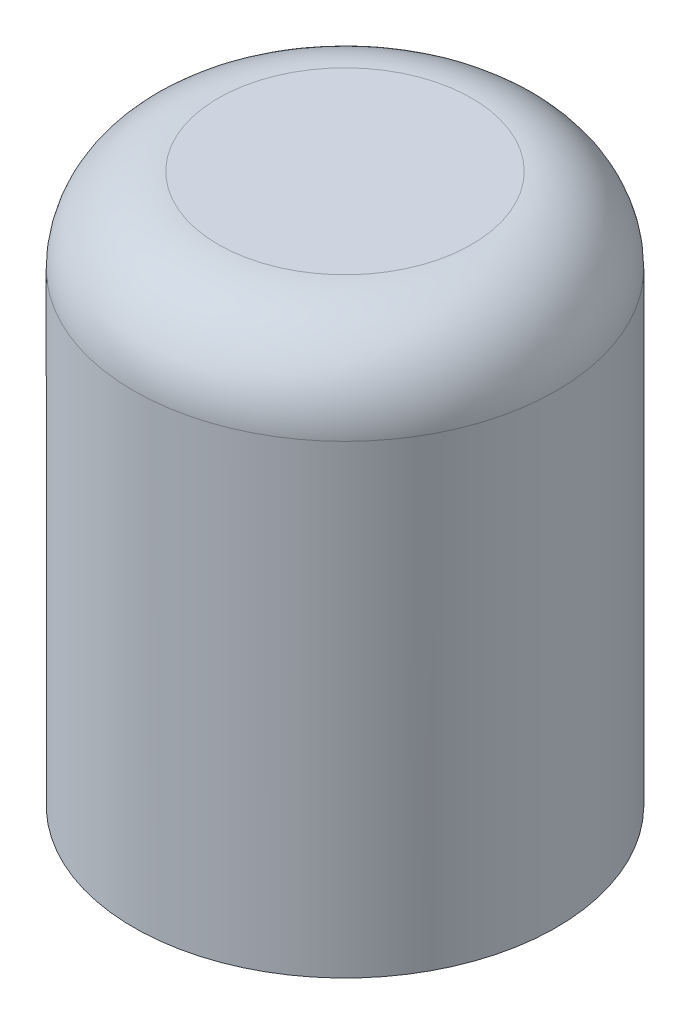
ISO-10303-21;
HEADER;
FILE_DESCRIPTION(('STEP AP214'),'2;1');
FILE_NAME('part.step','',(''),(''),'','','');
FILE_SCHEMA(('AUTOMOTIVE_DESIGN { 1 0 10303 214 1 1 1 1 }'));
ENDSEC;
DATA;
#1=APPLICATION_CONTEXT('core data for automotive mechanical design processes');
#2=APPLICATION_PROTOCOL_DEFINITION('international standard','automotive_design',2000,#1);
#3=PRODUCT_CONTEXT('',#1,'mechanical');
#4=PRODUCT('Part','Part','',(#3));
#5=PRODUCT_RELATED_PRODUCT_CATEGORY('part','',(#4));
#6=PRODUCT_DEFINITION_FORMATION('','',#4);
#7=PRODUCT_DEFINITION_CONTEXT('part definition',#1,'design');
#8=PRODUCT_DEFINITION('design','',#6,#7);
#9=PRODUCT_DEFINITION_SHAPE('','',#8);
#10=(LENGTH_UNIT() NAMED_UNIT(*) SI_UNIT(.MILLI.,.METRE.));
#11=(NAMED_UNIT(*) PLANE_ANGLE_UNIT() SI_UNIT($,.RADIAN.));
#12=(NAMED_UNIT(*) SI_UNIT($,.STERADIAN.) SOLID_ANGLE_UNIT());
#13=UNCERTAINTY_MEASURE_WITH_UNIT(LENGTH_MEASURE(1.E-05),#10,'distance_accuracy_value','');
#14=(GEOMETRIC_REPRESENTATION_CONTEXT(3) GLOBAL_UNCERTAINTY_ASSIGNED_CONTEXT((#13)) GLOBAL_UNIT_ASSIGNED_CONTEXT((#10,
#11,#12)) REPRESENTATION_CONTEXT('',''));
#15=CARTESIAN_POINT('',(0.,0.,0.));
#16=DIRECTION('',(0.,0.,1.));
#17=DIRECTION('',(1.,0.,0.));
#18=AXIS2_PLACEMENT_3D('',#15,#16,#17);
#19=CARTESIAN_POINT('',(0.,11.,0.));
#20=DIRECTION('',(0.,1.,0.));
#21=DIRECTION('',(0.,0.,1.));
#22=AXIS2_PLACEMENT_3D('',#19,#20,#21);
#23=TOROIDAL_SURFACE('',#22,3.,2.);
#24=CARTESIAN_POINT('',(0.,13.,0.));
#25=DIRECTION('',(0.,1.,0.));
#26=DIRECTION('',(0.,0.,1.));
#27=AXIS2_PLACEMENT_3D('',#24,#25,#26);
#28=CIRCLE('',#27,3.);
#29=CARTESIAN_POINT('',(0.,13.,3.));
#30=VERTEX_POINT('',#29);
#31=EDGE_CURVE('E40',#30,#30,#28,.T.);
#32=ORIENTED_EDGE('',*,*,#31,.F.);
#33=EDGE_LOOP('',(#32));
#34=FACE_BOUND('',#33,.T.);
#35=CARTESIAN_POINT('',(0.,11.,0.));
#36=DIRECTION('',(0.,1.,0.));
#37=DIRECTION('',(0.,0.,1.));
#38=AXIS2_PLACEMENT_3D('',#35,#36,#37);
#39=CIRCLE('',#38,5.);
#40=CARTESIAN_POINT('',(0.,11.,-5.));
#41=VERTEX_POINT('',#40);
#42=EDGE_CURVE('E11',#41,#41,#39,.F.);
#43=ORIENTED_EDGE('',*,*,#42,.F.);
#44=EDGE_LOOP('',(#43));
#45=FACE_BOUND('',#44,.T.);
#46=ADVANCED_FACE('F33',(#34,#45),#23,.T.);
#47=CARTESIAN_POINT('',(0.,0.5,0.));
#48=DIRECTION('',(0.,1.,0.));
#49=DIRECTION('',(0.,0.,1.));
#50=AXIS2_PLACEMENT_3D('',#47,#48,#49);
#51=TOROIDAL_SURFACE('',#50,3.9,0.5);
#52=CARTESIAN_POINT('',(-1.6,0.5,-3.));
#53=CARTESIAN_POINT('',(-1.59996653336158,0.474655655045489,-2.99997748759709));
#54=CARTESIAN_POINT('',(-1.60192456088418,0.449343334582389,-3.00115475988792));
#55=CARTESIAN_POINT('',(-1.60954931175446,0.39960635434801,-3.0057256157953));
#56=CARTESIAN_POINT('',(-1.61519862589409,0.375178093044717,-3.00910879553703));
#57=CARTESIAN_POINT('',(-1.62992846621741,0.327807220219106,-3.01790664048083));
#58=CARTESIAN_POINT('',(-1.63900537969103,0.304863074151547,-3.02331916669712));
#59=CARTESIAN_POINT('',(-1.66018400945888,0.260924715208379,-3.03590220306984));
#60=CARTESIAN_POINT('',(-1.672288612033,0.239932389337187,-3.04307439057656));
#61=CARTESIAN_POINT('',(-1.69984315670586,0.199143280719104,-3.05933078320421));
#62=CARTESIAN_POINT('',(-1.71544511489751,0.179484057228913,-3.06850103812007));
#63=CARTESIAN_POINT('',(-1.74900696316234,0.143043246008861,-3.08812587621663));
#64=CARTESIAN_POINT('',(-1.76696746391606,0.126262406162343,-3.09858079198013));
#65=CARTESIAN_POINT('',(-1.80732775012166,0.0936707605734556,-3.1219439158314));
#66=CARTESIAN_POINT('',(-1.82999944302008,0.0782976180755462,-3.134992718335));
#67=CARTESIAN_POINT('',(-1.87715528907021,0.0515854108273254,-3.16195210210392));
#68=CARTESIAN_POINT('',(-1.90164126290976,0.0402504666248506,-3.17586354671094));
#69=CARTESIAN_POINT('',(-1.95393263916719,0.0209334381087745,-3.20536936435397));
#70=CARTESIAN_POINT('',(-1.98184477585947,0.0133083882556781,-3.22100750525132));
#71=CARTESIAN_POINT('',(-2.03840760979031,0.00297884686105236,-3.25246275252574));
#72=CARTESIAN_POINT('',(-2.0670565310083,0.000263475752786359,-3.26827938485846));
#73=CARTESIAN_POINT('',(-2.0971516151827,6.07421043160522E-06,-3.28477494525696));
#74=CARTESIAN_POINT('',(-2.09857580350981,-1.17873286186587E-08,-3.28555528331048));
#75=CARTESIAN_POINT('',(-2.1,0.,-3.286335345031));
#76=B_SPLINE_CURVE_WITH_KNOTS('',3,(#52,#53,#54,#55,#56,#57,#58,#59,#60,#61,#62,#63,#64,#65,#66,
#67,#68,#69,#70,#71,#72,#73,#74,#75),.UNSPECIFIED.,.F.,.F.,(4,2,2,2,2,2,2,2,2,2,2,4),(0.,
0.0758798719797855,0.151404430177597,0.22684960623021,0.302366979720791,0.382214239752754,
0.462082214978432,0.552745106091461,0.643500245755483,0.741799513398234,0.839880687285974,
0.844752542984097),.UNSPECIFIED.);
#77=CARTESIAN_POINT('',(-2.1,0.,-3.286335345031));
#78=VERTEX_POINT('',#77);
#79=CARTESIAN_POINT('',(-1.6,0.5,-3.));
#80=VERTEX_POINT('',#79);
#81=EDGE_CURVE('E55',#78,#80,#76,.F.);
#82=ORIENTED_EDGE('',*,*,#81,.F.);
#83=CARTESIAN_POINT('',(0.,0.,0.));
#84=DIRECTION('',(0.,1.,0.));
#85=DIRECTION('',(0.,0.,1.));
#86=AXIS2_PLACEMENT_3D('',#83,#84,#85);
#87=CIRCLE('',#86,3.9);
#88=CARTESIAN_POINT('',(-2.1,0.,3.286335345031));
#89=VERTEX_POINT('',#88);
#90=EDGE_CURVE('E85',#89,#78,#87,.T.);
#91=ORIENTED_EDGE('',*,*,#90,.F.);
#92=CARTESIAN_POINT('',(-1.6,0.5,3.));
#93=CARTESIAN_POINT('',(-1.59996653336158,0.474655655045489,2.99997748759709));
#94=CARTESIAN_POINT('',(-1.60192456088418,0.449343334582389,3.00115475988792));
#95=CARTESIAN_POINT('',(-1.60954931175446,0.39960635434801,3.0057256157953));
#96=CARTESIAN_POINT('',(-1.61519862589409,0.375178093044717,3.00910879553703));
#97=CARTESIAN_POINT('',(-1.62992846621741,0.327807220219106,3.01790664048083));
#98=CARTESIAN_POINT('',(-1.63900537969103,0.304863074151547,3.02331916669712));
#99=CARTESIAN_POINT('',(-1.66018400945888,0.260924715208379,3.03590220306984));
#100=CARTESIAN_POINT('',(-1.672288612033,0.239932389337187,3.04307439057656));
#101=CARTESIAN_POINT('',(-1.69984315670586,0.199143280719104,3.05933078320421));
#102=CARTESIAN_POINT('',(-1.71544511489751,0.179484057228913,3.06850103812007));
#103=CARTESIAN_POINT('',(-1.74900696316234,0.143043246008861,3.08812587621663));
#104=CARTESIAN_POINT('',(-1.76696746391606,0.126262406162343,3.09858079198013));
#105=CARTESIAN_POINT('',(-1.80732775012166,0.0936707605734556,3.1219439158314));
#106=CARTESIAN_POINT('',(-1.82999944302008,0.0782976180755462,3.134992718335));
#107=CARTESIAN_POINT('',(-1.87715528907021,0.0515854108273254,3.16195210210392));
#108=CARTESIAN_POINT('',(-1.90164126290976,0.0402504666248506,3.17586354671094));
#109=CARTESIAN_POINT('',(-1.95393263916719,0.0209334381087745,3.20536936435397));
#110=CARTESIAN_POINT('',(-1.98184477585947,0.0133083882556781,3.22100750525132));
#111=CARTESIAN_POINT('',(-2.03840760979031,0.00297884686105236,3.25246275252574));
#112=CARTESIAN_POINT('',(-2.0670565310083,0.000263475752786359,3.26827938485846));
#113=CARTESIAN_POINT('',(-2.0971516151827,6.07421043160522E-06,3.28477494525696));
#114=CARTESIAN_POINT('',(-2.09857580350981,-1.17873286186587E-08,3.28555528331048));
#115=CARTESIAN_POINT('',(-2.1,0.,3.286335345031));
#116=B_SPLINE_CURVE_WITH_KNOTS('',3,(#92,#93,#94,#95,#96,#97,#98,#99,#100,#101,#102,#103,#104,
#105,#106,#107,#108,#109,#110,#111,#112,#113,#114,#115),.UNSPECIFIED.,.F.,.F.,(4,2,2,2,2,2,2,2,
2,2,2,4),(0.,0.0758798719797855,0.151404430177597,0.22684960623021,0.302366979720791,
0.382214239752754,0.462082214978432,0.552745106091461,0.643500245755483,0.741799513398234,
0.839880687285974,0.844752542984097),.UNSPECIFIED.);
#117=CARTESIAN_POINT('',(-1.6,0.5,3.));
#118=VERTEX_POINT('',#117);
#119=EDGE_CURVE('E47',#89,#118,#116,.F.);
#120=ORIENTED_EDGE('',*,*,#119,.T.);
#121=CARTESIAN_POINT('',(0.,0.5,0.));
#122=DIRECTION('',(0.,1.,0.));
#123=DIRECTION('',(0.,0.,1.));
#124=AXIS2_PLACEMENT_3D('',#121,#122,#123);
#125=CIRCLE('',#124,3.4);
#126=EDGE_CURVE('E105',#80,#118,#125,.F.);
#127=ORIENTED_EDGE('',*,*,#126,.F.);
#128=EDGE_LOOP('',(#82,#91,#120,#127));
#129=FACE_BOUND('',#128,.T.);
#130=ADVANCED_FACE('F128',(#129),#51,.T.);
#131=CARTESIAN_POINT('',(-2.1,0.5,0.));
#132=DIRECTION('',(0.,0.,1.));
#133=DIRECTION('',(1.,0.,0.));
#134=AXIS2_PLACEMENT_3D('',#131,#132,#133);
#135=CYLINDRICAL_SURFACE('',#134,0.5);
#136=DIRECTION('',(0.,0.,1.));
#137=VECTOR('',#136,1.);
#138=CARTESIAN_POINT('',(-2.1,0.,0.));
#139=LINE('',#138,#137);
#140=EDGE_CURVE('E241',#78,#89,#139,.T.);
#141=ORIENTED_EDGE('',*,*,#140,.F.);
#142=ORIENTED_EDGE('',*,*,#81,.T.);
#143=DIRECTION('',(0.,0.,1.));
#144=VECTOR('',#143,1.);
#145=CARTESIAN_POINT('',(-1.6,0.5,3.));
#146=LINE('',#145,#144);
#147=EDGE_CURVE('E242',#118,#80,#146,.F.);
#148=ORIENTED_EDGE('',*,*,#147,.F.);
#149=ORIENTED_EDGE('',*,*,#119,.F.);
#150=EDGE_LOOP('',(#141,#142,#148,#149));
#151=FACE_BOUND('',#150,.T.);
#152=ADVANCED_FACE('F127',(#151),#135,.T.);
#153=CARTESIAN_POINT('',(0.4,10.5,3.));
#154=DIRECTION('',(0.,0.,1.));
#155=DIRECTION('',(1.,0.,0.));
#156=AXIS2_PLACEMENT_3D('',#153,#154,#155);
#157=CYLINDRICAL_SURFACE('',#156,2.);
#158=CARTESIAN_POINT('',(-1.6,10.5,3.));
#159=CARTESIAN_POINT('',(-1.60000850052448,10.5499518875477,3.00000246288949));
#160=CARTESIAN_POINT('',(-1.59812880702974,10.5998996094297,2.99887721606991));
#161=CARTESIAN_POINT('',(-1.5906577194978,10.6994029975552,2.9943909238045));
#162=CARTESIAN_POINT('',(-1.5850672892926,10.7489587622248,2.9910304589369));
#163=CARTESIAN_POINT('',(-1.57026579448421,10.847145439876,2.98210926909196));
#164=CARTESIAN_POINT('',(-1.5610677133565,10.8957790208977,2.97655643370621));
#165=CARTESIAN_POINT('',(-1.53918254627121,10.9919416066029,2.96329220666491));
#166=CARTESIAN_POINT('',(-1.52649536552977,11.0394705812409,2.95558075636895));
#167=CARTESIAN_POINT('',(-1.48344028707066,11.1798536812875,2.92928276191602));
#168=CARTESIAN_POINT('',(-1.44805692833628,11.2706459903938,2.90751961592628));
#169=CARTESIAN_POINT('',(-1.36565775318506,11.4443077197239,2.85605095302861));
#170=CARTESIAN_POINT('',(-1.31863555075307,11.5271727556783,2.82634107517395));
#171=CARTESIAN_POINT('',(-1.21298744874626,11.6864896785948,2.75825266379178));
#172=CARTESIAN_POINT('',(-1.15397639945733,11.762558676547,2.71957793691912));
#173=CARTESIAN_POINT('',(-1.02815406520325,11.9033178959098,2.6349845426604));
#174=CARTESIAN_POINT('',(-0.961340390469918,11.9680046158989,2.58906365441816));
#175=CARTESIAN_POINT('',(-0.814288092836759,12.0924283419519,2.48484586936023));
#176=CARTESIAN_POINT('',(-0.733393441087431,12.1507000293333,2.42572953336291));
#177=CARTESIAN_POINT('',(-0.568326358374677,12.2526474266485,2.29998549858874));
#178=CARTESIAN_POINT('',(-0.484151709712952,12.2963130629015,2.23335265791833));
#179=CARTESIAN_POINT('',(-0.302097433662295,12.3757473093935,2.08186691219491));
#180=CARTESIAN_POINT('',(-0.204184044483526,12.4091276820456,1.99580557853499));
#181=CARTESIAN_POINT('',(-0.0126260183175983,12.459476367687,1.81484167051084));
#182=CARTESIAN_POINT('',(0.0810206871817594,12.4764527158765,1.71994344972939));
#183=CARTESIAN_POINT('',(0.248895876606051,12.4958446022482,1.53347825387043));
#184=CARTESIAN_POINT('',(0.324094306478029,12.4997991416193,1.44294663881494));
#185=CARTESIAN_POINT('',(0.396356673937455,12.499997534813,1.34652214633477));
#186=CARTESIAN_POINT('',(0.398179951667647,12.5000000202477,1.34408262845093));
#187=CARTESIAN_POINT('',(0.4,12.5,1.34164078649987));
#188=B_SPLINE_CURVE_WITH_KNOTS('',3,(#158,#159,#160,#161,#162,#163,#164,#165,#166,#167,#168,
#169,#170,#171,#172,#173,#174,#175,#176,#177,#178,#179,#180,#181,#182,#183,#184,#185,#186,#187),
.UNSPECIFIED.,.F.,.F.,(4,2,2,2,2,2,2,2,2,2,2,2,2,2,4),(0.,0.149800595576883,0.299562296952954,
0.448789898870816,0.598021555063173,0.89605758056682,1.1942574967554,1.5042427389955,
1.81432317295878,2.16069390970938,2.50730304548163,2.90947850423739,3.31145686495936,
3.66380374430213,3.67294048712481),.UNSPECIFIED.);
#189=CARTESIAN_POINT('',(-1.6,10.5,3.));
#190=VERTEX_POINT('',#189);
#191=CARTESIAN_POINT('',(0.4,12.5,1.34164078649987));
#192=VERTEX_POINT('',#191);
#193=EDGE_CURVE('E74',#190,#192,#188,.T.);
#194=ORIENTED_EDGE('',*,*,#193,.F.);
#195=DIRECTION('',(0.,0.,1.));
#196=VECTOR('',#195,1.);
#197=CARTESIAN_POINT('',(-1.6,10.5,3.));
#198=LINE('',#197,#196);
#199=CARTESIAN_POINT('',(-1.6,10.5,-3.));
#200=VERTEX_POINT('',#199);
#201=EDGE_CURVE('E77',#200,#190,#198,.T.);
#202=ORIENTED_EDGE('',*,*,#201,.F.);
#203=CARTESIAN_POINT('',(-1.6,10.5,-3.));
#204=CARTESIAN_POINT('',(-1.60000850052448,10.5499518875477,-3.00000246288949));
#205=CARTESIAN_POINT('',(-1.59812880702974,10.5998996094297,-2.99887721606991));
#206=CARTESIAN_POINT('',(-1.5906577194978,10.6994029975552,-2.9943909238045));
#207=CARTESIAN_POINT('',(-1.5850672892926,10.7489587622248,-2.9910304589369));
#208=CARTESIAN_POINT('',(-1.57026579448421,10.847145439876,-2.98210926909196));
#209=CARTESIAN_POINT('',(-1.5610677133565,10.8957790208977,-2.97655643370621));
#210=CARTESIAN_POINT('',(-1.53918254627121,10.9919416066029,-2.96329220666491));
#211=CARTESIAN_POINT('',(-1.52649536552977,11.0394705812409,-2.95558075636895));
#212=CARTESIAN_POINT('',(-1.48344028707066,11.1798536812875,-2.92928276191602));
#213=CARTESIAN_POINT('',(-1.44805692833628,11.2706459903938,-2.90751961592628));
#214=CARTESIAN_POINT('',(-1.36565775318506,11.4443077197239,-2.85605095302861));
#215=CARTESIAN_POINT('',(-1.31863555075307,11.5271727556783,-2.82634107517395));
#216=CARTESIAN_POINT('',(-1.21298744874626,11.6864896785948,-2.75825266379178));
#217=CARTESIAN_POINT('',(-1.15397639945733,11.762558676547,-2.71957793691912));
#218=CARTESIAN_POINT('',(-1.02815406520325,11.9033178959098,-2.6349845426604));
#219=CARTESIAN_POINT('',(-0.961340390469918,11.9680046158989,-2.58906365441816));
#220=CARTESIAN_POINT('',(-0.814288092836759,12.0924283419519,-2.48484586936023));
#221=CARTESIAN_POINT('',(-0.733393441087431,12.1507000293333,-2.42572953336291));
#222=CARTESIAN_POINT('',(-0.568326358374677,12.2526474266485,-2.29998549858874));
#223=CARTESIAN_POINT('',(-0.484151709712952,12.2963130629015,-2.23335265791833));
#224=CARTESIAN_POINT('',(-0.302097433662295,12.3757473093935,-2.08186691219491));
#225=CARTESIAN_POINT('',(-0.204184044483526,12.4091276820456,-1.99580557853499));
#226=CARTESIAN_POINT('',(-0.0126260183175983,12.459476367687,-1.81484167051084));
#227=CARTESIAN_POINT('',(0.0810206871817594,12.4764527158765,-1.71994344972939));
#228=CARTESIAN_POINT('',(0.248895876606051,12.4958446022482,-1.53347825387043));
#229=CARTESIAN_POINT('',(0.324094306478029,12.4997991416193,-1.44294663881494));
#230=CARTESIAN_POINT('',(0.396356673937455,12.499997534813,-1.34652214633477));
#231=CARTESIAN_POINT('',(0.398179951667647,12.5000000202477,-1.34408262845093));
#232=CARTESIAN_POINT('',(0.4,12.5,-1.34164078649987));
#233=B_SPLINE_CURVE_WITH_KNOTS('',3,(#203,#204,#205,#206,#207,#208,#209,#210,#211,#212,#213,
#214,#215,#216,#217,#218,#219,#220,#221,#222,#223,#224,#225,#226,#227,#228,#229,#230,#231,#232),
.UNSPECIFIED.,.F.,.F.,(4,2,2,2,2,2,2,2,2,2,2,2,2,2,4),(0.,0.149800595576883,0.299562296952954,
0.448789898870816,0.598021555063173,0.89605758056682,1.1942574967554,1.5042427389955,
1.81432317295878,2.16069390970938,2.50730304548163,2.90947850423739,3.31145686495936,
3.66380374430213,3.67294048712481),.UNSPECIFIED.);
#234=CARTESIAN_POINT('',(0.4,12.5,-1.34164078649987));
#235=VERTEX_POINT('',#234);
#236=EDGE_CURVE('E86',#200,#235,#233,.T.);
#237=ORIENTED_EDGE('',*,*,#236,.T.);
#238=DIRECTION('',(0.,0.,1.));
#239=VECTOR('',#238,1.);
#240=CARTESIAN_POINT('',(0.4,12.5,0.));
#241=LINE('',#240,#239);
#242=EDGE_CURVE('E80',#192,#235,#241,.F.);
#243=ORIENTED_EDGE('',*,*,#242,.F.);
#244=EDGE_LOOP('',(#194,#202,#237,#243));
#245=FACE_BOUND('',#244,.T.);
#246=ADVANCED_FACE('F76',(#245),#157,.F.);
#247=CARTESIAN_POINT('',(0.,10.5,0.));
#248=DIRECTION('',(0.,-1.,0.));
#249=DIRECTION('',(0.,0.,-1.));
#250=AXIS2_PLACEMENT_3D('',#247,#248,#249);
#251=DEGENERATE_TOROIDAL_SURFACE('',#250,1.4,2.,.T.);
#252=CARTESIAN_POINT('',(0.,10.5,0.));
#253=DIRECTION('',(0.,-1.,0.));
#254=DIRECTION('',(0.,0.,-1.));
#255=AXIS2_PLACEMENT_3D('',#252,#253,#254);
#256=CIRCLE('',#255,3.4);
#257=EDGE_CURVE('E99',#190,#200,#256,.F.);
#258=ORIENTED_EDGE('',*,*,#257,.F.);
#259=ORIENTED_EDGE('',*,*,#193,.T.);
#260=CARTESIAN_POINT('',(0.,12.5,0.));
#261=DIRECTION('',(0.,-1.,0.));
#262=DIRECTION('',(0.,0.,-1.));
#263=AXIS2_PLACEMENT_3D('',#260,#261,#262);
#264=CIRCLE('',#263,1.4);
#265=EDGE_CURVE('E97',#235,#192,#264,.T.);
#266=ORIENTED_EDGE('',*,*,#265,.F.);
#267=ORIENTED_EDGE('',*,*,#236,.F.);
#268=EDGE_LOOP('',(#258,#259,#266,#267));
#269=FACE_BOUND('',#268,.T.);
#270=ADVANCED_FACE('F100',(#269),#251,.F.);
#271=CARTESIAN_POINT('',(0.,13.,0.));
#272=DIRECTION('',(0.,-1.,0.));
#273=DIRECTION('',(0.,0.,-1.));
#274=AXIS2_PLACEMENT_3D('',#271,#272,#273);
#275=CYLINDRICAL_SURFACE('',#274,5.);
#276=CARTESIAN_POINT('',(0.,0.,0.));
#277=DIRECTION('',(0.,1.,0.));
#278=DIRECTION('',(0.,0.,1.));
#279=AXIS2_PLACEMENT_3D('',#276,#277,#278);
#280=CIRCLE('',#279,5.);
#281=CARTESIAN_POINT('',(0.,0.,-5.));
#282=VERTEX_POINT('',#281);
#283=EDGE_CURVE('E102',#282,#282,#280,.T.);
#284=CARTESIAN_POINT('',(0.,11.,-5.));
#285=CARTESIAN_POINT('',(0.,10.8854166666667,-5.));
#286=CARTESIAN_POINT('',(0.,10.7708333333333,-5.));
#287=CARTESIAN_POINT('',(0.,10.5416666666667,-5.));
#288=CARTESIAN_POINT('',(0.,10.4270833333333,-5.));
#289=CARTESIAN_POINT('',(0.,10.1979166666667,-5.));
#290=CARTESIAN_POINT('',(0.,10.0833333333333,-5.));
#291=CARTESIAN_POINT('',(0.,9.85416666666667,-5.));
#292=CARTESIAN_POINT('',(0.,9.73958333333333,-5.));
#293=CARTESIAN_POINT('',(0.,9.51041666666667,-5.));
#294=CARTESIAN_POINT('',(0.,9.39583333333333,-5.));
#295=CARTESIAN_POINT('',(0.,9.16666666666666,-5.));
#296=CARTESIAN_POINT('',(0.,9.05208333333333,-5.));
#297=CARTESIAN_POINT('',(0.,8.82291666666666,-5.));
#298=CARTESIAN_POINT('',(0.,8.70833333333333,-5.));
#299=CARTESIAN_POINT('',(0.,8.47916666666666,-5.));
#300=CARTESIAN_POINT('',(0.,8.36458333333333,-5.));
#301=CARTESIAN_POINT('',(0.,8.13541666666667,-5.));
#302=CARTESIAN_POINT('',(0.,8.02083333333333,-5.));
#303=CARTESIAN_POINT('',(0.,7.79166666666667,-5.));
#304=CARTESIAN_POINT('',(0.,7.67708333333333,-5.));
#305=CARTESIAN_POINT('',(0.,7.44791666666667,-5.));
#306=CARTESIAN_POINT('',(0.,7.33333333333333,-5.));
#307=CARTESIAN_POINT('',(0.,7.10416666666667,-5.));
#308=CARTESIAN_POINT('',(0.,6.98958333333333,-5.));
#309=CARTESIAN_POINT('',(0.,6.76041666666667,-5.));
#310=CARTESIAN_POINT('',(0.,6.64583333333333,-5.));
#311=CARTESIAN_POINT('',(0.,6.41666666666667,-5.));
#312=CARTESIAN_POINT('',(0.,6.30208333333333,-5.));
#313=CARTESIAN_POINT('',(0.,6.07291666666667,-5.));
#314=CARTESIAN_POINT('',(0.,5.95833333333333,-5.));
#315=CARTESIAN_POINT('',(0.,5.72916666666667,-5.));
#316=CARTESIAN_POINT('',(0.,5.61458333333333,-5.));
#317=CARTESIAN_POINT('',(0.,5.38541666666667,-5.));
#318=CARTESIAN_POINT('',(0.,5.27083333333333,-5.));
#319=CARTESIAN_POINT('',(0.,5.04166666666667,-5.));
#320=CARTESIAN_POINT('',(0.,4.92708333333333,-5.));
#321=CARTESIAN_POINT('',(0.,4.69791666666667,-5.));
#322=CARTESIAN_POINT('',(0.,4.58333333333333,-5.));
#323=CARTESIAN_POINT('',(0.,4.35416666666667,-5.));
#324=CARTESIAN_POINT('',(0.,4.23958333333333,-5.));
#325=CARTESIAN_POINT('',(0.,4.01041666666667,-5.));
#326=CARTESIAN_POINT('',(0.,3.89583333333333,-5.));
#327=CARTESIAN_POINT('',(0.,3.66666666666667,-5.));
#328=CARTESIAN_POINT('',(0.,3.55208333333333,-5.));
#329=CARTESIAN_POINT('',(0.,3.32291666666667,-5.));
#330=CARTESIAN_POINT('',(0.,3.20833333333333,-5.));
#331=CARTESIAN_POINT('',(0.,2.97916666666667,-5.));
#332=CARTESIAN_POINT('',(0.,2.86458333333333,-5.));
#333=CARTESIAN_POINT('',(0.,2.63541666666667,-5.));
#334=CARTESIAN_POINT('',(0.,2.52083333333333,-5.));
#335=CARTESIAN_POINT('',(0.,2.29166666666667,-5.));
#336=CARTESIAN_POINT('',(0.,2.17708333333333,-5.));
#337=CARTESIAN_POINT('',(0.,1.94791666666667,-5.));
#338=CARTESIAN_POINT('',(0.,1.83333333333333,-5.));
#339=CARTESIAN_POINT('',(0.,1.60416666666667,-5.));
#340=CARTESIAN_POINT('',(0.,1.48958333333333,-5.));
#341=CARTESIAN_POINT('',(0.,1.26041666666667,-5.));
#342=CARTESIAN_POINT('',(0.,1.14583333333333,-5.));
#343=CARTESIAN_POINT('',(0.,0.916666666666666,-5.));
#344=CARTESIAN_POINT('',(0.,0.802083333333333,-5.));
#345=CARTESIAN_POINT('',(0.,0.572916666666667,-5.));
#346=CARTESIAN_POINT('',(0.,0.458333333333334,-5.));
#347=CARTESIAN_POINT('',(0.,0.229166666666667,-5.));
#348=CARTESIAN_POINT('',(0.,0.114583333333334,-5.));
#349=CARTESIAN_POINT('',(0.,0.,-5.));
#350=B_SPLINE_CURVE_WITH_KNOTS('',3,(#284,#285,#286,#287,#288,#289,#290,#291,#292,#293,#294,
#295,#296,#297,#298,#299,#300,#301,#302,#303,#304,#305,#306,#307,#308,#309,#310,#311,#312,#313,
#314,#315,#316,#317,#318,#319,#320,#321,#322,#323,#324,#325,#326,#327,#328,#329,#330,#331,#332,
#333,#334,#335,#336,#337,#338,#339,#340,#341,#342,#343,#344,#345,#346,#347,#348,#349),
.UNSPECIFIED.,.F.,.F.,(4,2,2,2,2,2,2,2,2,2,2,2,2,2,2,2,2,2,2,2,2,2,2,2,2,2,2,2,2,2,2,2,4),(0.,
0.343749999999999,0.687499999999999,1.03125,1.375,1.71875,2.0625,2.40625,2.75,3.09375,3.4375,
3.78125,4.125,4.46875,4.8125,5.15625,5.5,5.84375,6.1875,6.53125,6.875,7.21875,7.5625,7.90625,
8.25,8.59375,8.9375,9.28125,9.625,9.96875,10.3125,10.65625,11.),.UNSPECIFIED.);
#351=EDGE_CURVE('BSEAM152',#41,#282,#350,.T.);
#352=ORIENTED_EDGE('',*,*,#42,.T.);
#353=ORIENTED_EDGE('',*,*,#283,.T.);
#354=ORIENTED_EDGE('',*,*,#351,.T.);
#355=ORIENTED_EDGE('',*,*,#351,.F.);
#356=EDGE_LOOP('',(#352,#354,#353,#355));
#357=FACE_BOUND('',#356,.T.);
#358=ADVANCED_FACE('F152',(#357),#275,.T.);
#359=CARTESIAN_POINT('',(0.,13.,0.));
#360=DIRECTION('',(0.,1.,0.));
#361=DIRECTION('',(0.,0.,1.));
#362=AXIS2_PLACEMENT_3D('',#359,#360,#361);
#363=PLANE('',#362);
#364=ORIENTED_EDGE('',*,*,#31,.T.);
#365=EDGE_LOOP('',(#364));
#366=FACE_BOUND('',#365,.T.);
#367=ADVANCED_FACE('F146',(#366),#363,.T.);
#368=CARTESIAN_POINT('',(0.,0.,0.));
#369=DIRECTION('',(0.,1.,0.));
#370=DIRECTION('',(0.,0.,1.));
#371=AXIS2_PLACEMENT_3D('',#368,#369,#370);
#372=PLANE('',#371);
#373=ORIENTED_EDGE('',*,*,#90,.T.);
#374=ORIENTED_EDGE('',*,*,#140,.T.);
#375=EDGE_LOOP('',(#373,#374));
#376=FACE_BOUND('',#375,.T.);
#377=ORIENTED_EDGE('',*,*,#283,.F.);
#378=EDGE_LOOP('',(#377));
#379=FACE_BOUND('',#378,.T.);
#380=ADVANCED_FACE('F157',(#376,#379),#372,.F.);
#381=CARTESIAN_POINT('',(0.,12.5,0.));
#382=DIRECTION('',(0.,-1.,0.));
#383=DIRECTION('',(0.,0.,-1.));
#384=AXIS2_PLACEMENT_3D('',#381,#382,#383);
#385=CYLINDRICAL_SURFACE('',#384,3.4);
#386=DIRECTION('',(0.,-1.,0.));
#387=VECTOR('',#386,1.);
#388=CARTESIAN_POINT('',(-1.6,12.5,-3.));
#389=LINE('',#388,#387);
#390=EDGE_CURVE('E96',#200,#80,#389,.T.);
#391=ORIENTED_EDGE('',*,*,#390,.T.);
#392=ORIENTED_EDGE('',*,*,#126,.T.);
#393=DIRECTION('',(0.,-1.,0.));
#394=VECTOR('',#393,1.);
#395=CARTESIAN_POINT('',(-1.6,12.5,3.));
#396=LINE('',#395,#394);
#397=EDGE_CURVE('E94',#190,#118,#396,.T.);
#398=ORIENTED_EDGE('',*,*,#397,.F.);
#399=ORIENTED_EDGE('',*,*,#257,.T.);
#400=EDGE_LOOP('',(#391,#392,#398,#399));
#401=FACE_BOUND('',#400,.T.);
#402=ADVANCED_FACE('F104',(#401),#385,.F.);
#403=CARTESIAN_POINT('',(-1.6,12.5,3.));
#404=DIRECTION('',(-1.,0.,0.));
#405=DIRECTION('',(0.,0.,1.));
#406=AXIS2_PLACEMENT_3D('',#403,#404,#405);
#407=PLANE('',#406);
#408=ORIENTED_EDGE('',*,*,#397,.T.);
#409=ORIENTED_EDGE('',*,*,#147,.T.);
#410=ORIENTED_EDGE('',*,*,#390,.F.);
#411=ORIENTED_EDGE('',*,*,#201,.T.);
#412=EDGE_LOOP('',(#408,#409,#410,#411));
#413=FACE_BOUND('',#412,.T.);
#414=ADVANCED_FACE('F91',(#413),#407,.F.);
#415=CARTESIAN_POINT('',(0.,12.5,0.));
#416=DIRECTION('',(0.,-1.,0.));
#417=DIRECTION('',(0.,0.,-1.));
#418=AXIS2_PLACEMENT_3D('',#415,#416,#417);
#419=PLANE('',#418);
#420=ORIENTED_EDGE('',*,*,#242,.T.);
#421=ORIENTED_EDGE('',*,*,#265,.T.);
#422=EDGE_LOOP('',(#420,#421));
#423=FACE_BOUND('',#422,.T.);
#424=ADVANCED_FACE('F171',(#423),#419,.T.);
#425=CLOSED_SHELL('',(#46,#130,#152,#246,#270,#358,#367,#380,#402,#414,#424));
#426=MANIFOLD_SOLID_BREP('B2',#425);
#427=ADVANCED_BREP_SHAPE_REPRESENTATION('',(#18,#426),#14);
#428=SHAPE_DEFINITION_REPRESENTATION(#9,#427);
ENDSEC;
END-ISO-10303-21;
